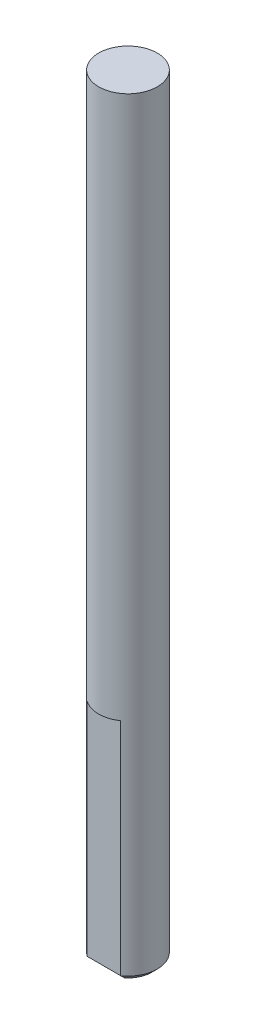
ISO-10303-21;
HEADER;
FILE_DESCRIPTION(('STEP AP214'),'2;1');
FILE_NAME('part.step','',(''),(''),'','','');
FILE_SCHEMA(('AUTOMOTIVE_DESIGN { 1 0 10303 214 1 1 1 1 }'));
ENDSEC;
DATA;
#1=APPLICATION_CONTEXT('core data for automotive mechanical design processes');
#2=APPLICATION_PROTOCOL_DEFINITION('international standard','automotive_design',2000,#1);
#3=PRODUCT_CONTEXT('',#1,'mechanical');
#4=PRODUCT('Part','Part','',(#3));
#5=PRODUCT_RELATED_PRODUCT_CATEGORY('part','',(#4));
#6=PRODUCT_DEFINITION_FORMATION('','',#4);
#7=PRODUCT_DEFINITION_CONTEXT('part definition',#1,'design');
#8=PRODUCT_DEFINITION('design','',#6,#7);
#9=PRODUCT_DEFINITION_SHAPE('','',#8);
#10=(LENGTH_UNIT() NAMED_UNIT(*) SI_UNIT(.MILLI.,.METRE.));
#11=(NAMED_UNIT(*) PLANE_ANGLE_UNIT() SI_UNIT($,.RADIAN.));
#12=(NAMED_UNIT(*) SI_UNIT($,.STERADIAN.) SOLID_ANGLE_UNIT());
#13=UNCERTAINTY_MEASURE_WITH_UNIT(LENGTH_MEASURE(1.E-05),#10,'distance_accuracy_value','');
#14=(GEOMETRIC_REPRESENTATION_CONTEXT(3) GLOBAL_UNCERTAINTY_ASSIGNED_CONTEXT((#13)) GLOBAL_UNIT_ASSIGNED_CONTEXT((#10,
#11,#12)) REPRESENTATION_CONTEXT('',''));
#15=CARTESIAN_POINT('',(0.,0.,0.));
#16=DIRECTION('',(0.,0.,1.));
#17=DIRECTION('',(1.,0.,0.));
#18=AXIS2_PLACEMENT_3D('',#15,#16,#17);
#19=CARTESIAN_POINT('',(0.,69.,0.));
#20=DIRECTION('',(0.,-1.,0.));
#21=DIRECTION('',(0.,0.,-1.));
#22=AXIS2_PLACEMENT_3D('',#19,#20,#21);
#23=CYLINDRICAL_SURFACE('',#22,2.625);
#24=CARTESIAN_POINT('',(0.,69.,0.));
#25=DIRECTION('',(0.,1.,0.));
#26=DIRECTION('',(0.,0.,1.));
#27=AXIS2_PLACEMENT_3D('',#24,#25,#26);
#28=CIRCLE('',#27,2.625);
#29=CARTESIAN_POINT('',(0.,69.,2.625));
#30=VERTEX_POINT('',#29);
#31=EDGE_CURVE('E107',#30,#30,#28,.T.);
#32=ORIENTED_EDGE('',*,*,#31,.F.);
#33=EDGE_LOOP('',(#32));
#34=FACE_BOUND('',#33,.T.);
#35=DIRECTION('',(0.,-1.,0.));
#36=VECTOR('',#35,1.);
#37=CARTESIAN_POINT('',(1.5,20.3,2.15421099245176));
#38=LINE('',#37,#36);
#39=CARTESIAN_POINT('',(1.5,20.3,2.15421099245176));
#40=VERTEX_POINT('',#39);
#41=CARTESIAN_POINT('',(1.5,0.5,2.15421099245176));
#42=VERTEX_POINT('',#41);
#43=EDGE_CURVE('E96',#40,#42,#38,.T.);
#44=ORIENTED_EDGE('',*,*,#43,.T.);
#45=CARTESIAN_POINT('',(0.,0.5,0.));
#46=DIRECTION('',(0.,1.,0.));
#47=DIRECTION('',(0.,0.,1.));
#48=AXIS2_PLACEMENT_3D('',#45,#46,#47);
#49=CIRCLE('',#48,2.625);
#50=CARTESIAN_POINT('',(-1.5,0.5,2.15421099245176));
#51=VERTEX_POINT('',#50);
#52=EDGE_CURVE('E11',#42,#51,#49,.T.);
#53=ORIENTED_EDGE('',*,*,#52,.T.);
#54=DIRECTION('',(0.,-1.,0.));
#55=VECTOR('',#54,1.);
#56=CARTESIAN_POINT('',(-1.5,20.3,2.15421099245176));
#57=LINE('',#56,#55);
#58=CARTESIAN_POINT('',(-1.5,20.3,2.15421099245176));
#59=VERTEX_POINT('',#58);
#60=EDGE_CURVE('E102',#59,#51,#57,.T.);
#61=ORIENTED_EDGE('',*,*,#60,.F.);
#62=CARTESIAN_POINT('',(0.,20.3,0.));
#63=DIRECTION('',(0.,1.,0.));
#64=DIRECTION('',(0.,0.,1.));
#65=AXIS2_PLACEMENT_3D('',#62,#63,#64);
#66=CIRCLE('',#65,2.625);
#67=EDGE_CURVE('E88',#59,#40,#66,.T.);
#68=ORIENTED_EDGE('',*,*,#67,.T.);
#69=EDGE_LOOP('',(#44,#53,#61,#68));
#70=FACE_BOUND('',#69,.T.);
#71=ADVANCED_FACE('F45',(#34,#70),#23,.T.);
#72=CARTESIAN_POINT('',(0.,69.,0.));
#73=DIRECTION('',(0.,1.,0.));
#74=DIRECTION('',(0.,0.,1.));
#75=AXIS2_PLACEMENT_3D('',#72,#73,#74);
#76=PLANE('',#75);
#77=ORIENTED_EDGE('',*,*,#31,.T.);
#78=EDGE_LOOP('',(#77));
#79=FACE_BOUND('',#78,.T.);
#80=ADVANCED_FACE('F138',(#79),#76,.T.);
#81=CARTESIAN_POINT('',(0.,0.,0.));
#82=DIRECTION('',(0.,1.,0.));
#83=DIRECTION('',(0.,0.,1.));
#84=AXIS2_PLACEMENT_3D('',#81,#82,#83);
#85=PLANE('',#84);
#86=CARTESIAN_POINT('',(0.,0.,0.));
#87=DIRECTION('',(0.,1.,0.));
#88=DIRECTION('',(0.,0.,1.));
#89=AXIS2_PLACEMENT_3D('',#86,#87,#88);
#90=CIRCLE('',#89,2.125);
#91=CARTESIAN_POINT('',(-1.33387068055781,0.,1.65421099245176));
#92=VERTEX_POINT('',#91);
#93=CARTESIAN_POINT('',(1.33387068055781,0.,1.65421099245176));
#94=VERTEX_POINT('',#93);
#95=EDGE_CURVE('E68',#92,#94,#90,.F.);
#96=ORIENTED_EDGE('',*,*,#95,.T.);
#97=DIRECTION('',(-1.,0.,0.));
#98=VECTOR('',#97,1.);
#99=CARTESIAN_POINT('',(0.,0.,1.65421099245176));
#100=LINE('',#99,#98);
#101=EDGE_CURVE('E61',#94,#92,#100,.T.);
#102=ORIENTED_EDGE('',*,*,#101,.T.);
#103=EDGE_LOOP('',(#96,#102));
#104=FACE_BOUND('',#103,.T.);
#105=ADVANCED_FACE('F140',(#104),#85,.F.);
#106=CARTESIAN_POINT('',(0.,20.3,2.15421099245176));
#107=DIRECTION('',(0.,0.,-1.));
#108=DIRECTION('',(-1.,0.,0.));
#109=AXIS2_PLACEMENT_3D('',#106,#107,#108);
#110=PLANE('',#109);
#111=ORIENTED_EDGE('',*,*,#60,.T.);
#112=DIRECTION('',(1.,0.,0.));
#113=VECTOR('',#112,1.);
#114=CARTESIAN_POINT('',(0.,0.499999999999997,2.15421099245176));
#115=LINE('',#114,#113);
#116=EDGE_CURVE('E112',#51,#42,#115,.T.);
#117=ORIENTED_EDGE('',*,*,#116,.T.);
#118=ORIENTED_EDGE('',*,*,#43,.F.);
#119=DIRECTION('',(1.,0.,0.));
#120=VECTOR('',#119,1.);
#121=CARTESIAN_POINT('',(0.,20.3,2.15421099245176));
#122=LINE('',#121,#120);
#123=EDGE_CURVE('E91',#59,#40,#122,.T.);
#124=ORIENTED_EDGE('',*,*,#123,.F.);
#125=EDGE_LOOP('',(#111,#117,#118,#124));
#126=FACE_BOUND('',#125,.T.);
#127=ADVANCED_FACE('F100',(#126),#110,.F.);
#128=CARTESIAN_POINT('',(0.,20.3,0.));
#129=DIRECTION('',(0.,1.,0.));
#130=DIRECTION('',(0.,0.,1.));
#131=AXIS2_PLACEMENT_3D('',#128,#129,#130);
#132=PLANE('',#131);
#133=ORIENTED_EDGE('',*,*,#123,.T.);
#134=ORIENTED_EDGE('',*,*,#67,.F.);
#135=EDGE_LOOP('',(#133,#134));
#136=FACE_BOUND('',#135,.T.);
#137=ADVANCED_FACE('F90',(#136),#132,.F.);
#138=CARTESIAN_POINT('',(0.,0.5,0.));
#139=DIRECTION('',(0.,1.,0.));
#140=DIRECTION('',(0.,0.,1.));
#141=AXIS2_PLACEMENT_3D('',#138,#139,#140);
#142=CONICAL_SURFACE('',#141,2.625,0.785398163397447);
#143=CARTESIAN_POINT('',(1.5,0.499999999999999,2.15421099245176));
#144=CARTESIAN_POINT('',(1.48688440529318,0.45821379466559,2.11242478711735));
#145=CARTESIAN_POINT('',(1.47360598829149,0.416453016751602,2.07066400920337));
#146=CARTESIAN_POINT('',(1.44669582802099,0.332990310771431,1.98720130322319));
#147=CARTESIAN_POINT('',(1.43306409981416,0.291288380276185,1.94549937272795));
#148=CARTESIAN_POINT('',(1.40541837551265,0.207947359008508,1.86215835146027));
#149=CARTESIAN_POINT('',(1.39140437531756,0.166308268915186,1.82051926136695));
#150=CARTESIAN_POINT('',(1.36295904790148,0.083099577270483,1.73731056972225));
#151=CARTESIAN_POINT('',(1.34852770293295,0.0415299787539713,1.69574097120573));
#152=CARTESIAN_POINT('',(1.33387068055781,0.,1.65421099245176));
#153=B_SPLINE_CURVE_WITH_KNOTS('',3,(#143,#144,#145,#146,#147,#148,#149,#150,#151,#152),
.UNSPECIFIED.,.F.,.F.,(4,2,2,2,4),(0.,0.1815977451254,0.36318776126785,0.544779725981038,
0.726379424256437),.UNSPECIFIED.);
#154=EDGE_CURVE('E121',#94,#42,#153,.F.);
#155=ORIENTED_EDGE('',*,*,#154,.F.);
#156=ORIENTED_EDGE('',*,*,#95,.F.);
#157=CARTESIAN_POINT('',(-1.33387068055781,0.,1.65421099245176));
#158=CARTESIAN_POINT('',(-1.34852770293295,0.0415299787539713,1.69574097120573));
#159=CARTESIAN_POINT('',(-1.36295904790148,0.0830995772704829,1.73731056972225));
#160=CARTESIAN_POINT('',(-1.39140437531756,0.166308268915186,1.82051926136695));
#161=CARTESIAN_POINT('',(-1.40541837551265,0.207947359008508,1.86215835146027));
#162=CARTESIAN_POINT('',(-1.43306409981416,0.291288380276185,1.94549937272795));
#163=CARTESIAN_POINT('',(-1.44669582802099,0.33299031077143,1.98720130322319));
#164=CARTESIAN_POINT('',(-1.47360598829148,0.416453016751602,2.07066400920337));
#165=CARTESIAN_POINT('',(-1.48688440529318,0.45821379466559,2.11242478711735));
#166=CARTESIAN_POINT('',(-1.49999999999999,0.499999999999999,2.15421099245176));
#167=B_SPLINE_CURVE_WITH_KNOTS('',3,(#157,#158,#159,#160,#161,#162,#163,#164,#165,#166),
.UNSPECIFIED.,.F.,.F.,(4,2,2,2,4),(0.,0.181599698275399,0.363191662988587,0.544781679131036,
0.726379424256437),.UNSPECIFIED.);
#168=EDGE_CURVE('E51',#51,#92,#167,.F.);
#169=ORIENTED_EDGE('',*,*,#168,.F.);
#170=ORIENTED_EDGE('',*,*,#52,.F.);
#171=EDGE_LOOP('',(#155,#156,#169,#170));
#172=FACE_BOUND('',#171,.T.);
#173=ADVANCED_FACE('F128',(#172),#142,.T.);
#174=CARTESIAN_POINT('',(0.,0.499999999999997,2.15421099245176));
#175=DIRECTION('',(0.,0.707106781186549,-0.707106781186546));
#176=DIRECTION('',(1.,0.,0.));
#177=AXIS2_PLACEMENT_3D('',#174,#175,#176);
#178=PLANE('',#177);
#179=ORIENTED_EDGE('',*,*,#168,.T.);
#180=ORIENTED_EDGE('',*,*,#101,.F.);
#181=ORIENTED_EDGE('',*,*,#154,.T.);
#182=ORIENTED_EDGE('',*,*,#116,.F.);
#183=EDGE_LOOP('',(#179,#180,#181,#182));
#184=FACE_BOUND('',#183,.T.);
#185=ADVANCED_FACE('F48',(#184),#178,.F.);
#186=CLOSED_SHELL('',(#71,#80,#105,#127,#137,#173,#185));
#187=MANIFOLD_SOLID_BREP('B2',#186);
#188=ADVANCED_BREP_SHAPE_REPRESENTATION('',(#18,#187),#14);
#189=SHAPE_DEFINITION_REPRESENTATION(#9,#188);
ENDSEC;
END-ISO-10303-21;
